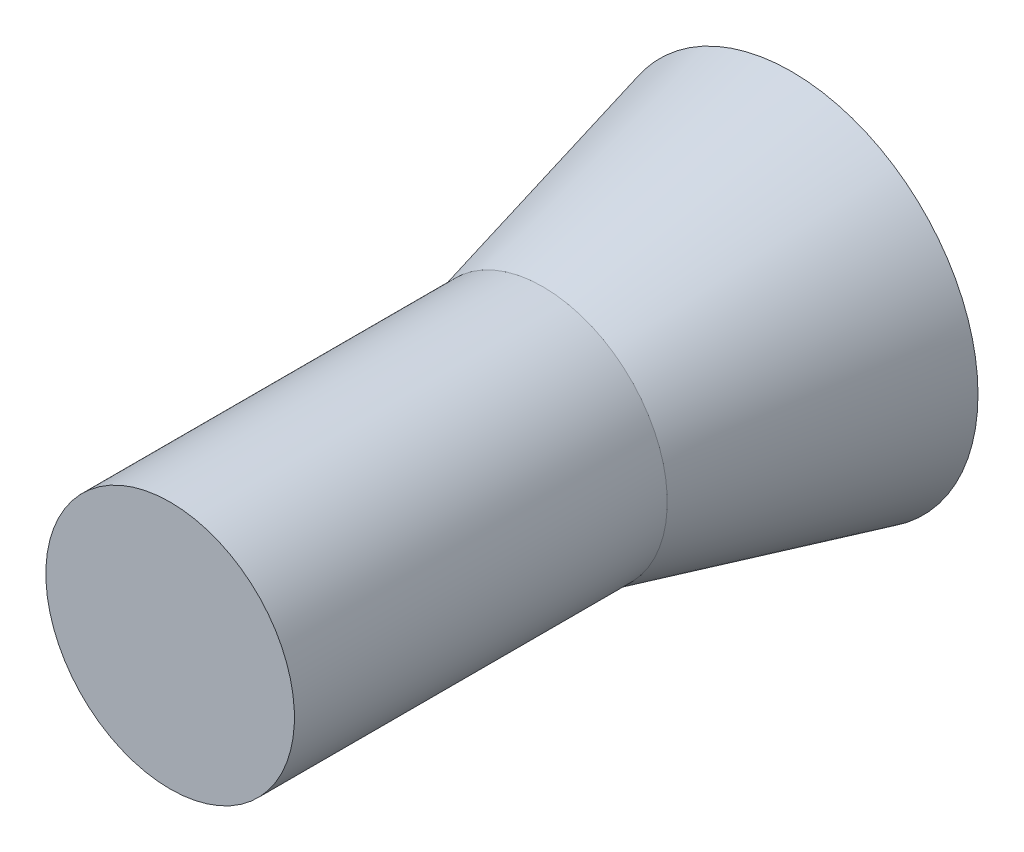
ISO-10303-21;
HEADER;
FILE_DESCRIPTION(('STEP AP214'),'2;1');
FILE_NAME('part.step','',(''),(''),'','','');
FILE_SCHEMA(('AUTOMOTIVE_DESIGN { 1 0 10303 214 1 1 1 1 }'));
ENDSEC;
DATA;
#1=APPLICATION_CONTEXT('core data for automotive mechanical design processes');
#2=APPLICATION_PROTOCOL_DEFINITION('international standard','automotive_design',2000,#1);
#3=PRODUCT_CONTEXT('',#1,'mechanical');
#4=PRODUCT('Part','Part','',(#3));
#5=PRODUCT_RELATED_PRODUCT_CATEGORY('part','',(#4));
#6=PRODUCT_DEFINITION_FORMATION('','',#4);
#7=PRODUCT_DEFINITION_CONTEXT('part definition',#1,'design');
#8=PRODUCT_DEFINITION('design','',#6,#7);
#9=PRODUCT_DEFINITION_SHAPE('','',#8);
#10=(LENGTH_UNIT() NAMED_UNIT(*) SI_UNIT(.MILLI.,.METRE.));
#11=(NAMED_UNIT(*) PLANE_ANGLE_UNIT() SI_UNIT($,.RADIAN.));
#12=(NAMED_UNIT(*) SI_UNIT($,.STERADIAN.) SOLID_ANGLE_UNIT());
#13=UNCERTAINTY_MEASURE_WITH_UNIT(LENGTH_MEASURE(1.E-05),#10,'distance_accuracy_value','');
#14=(GEOMETRIC_REPRESENTATION_CONTEXT(3) GLOBAL_UNCERTAINTY_ASSIGNED_CONTEXT((#13)) GLOBAL_UNIT_ASSIGNED_CONTEXT((#10,
#11,#12)) REPRESENTATION_CONTEXT('',''));
#15=CARTESIAN_POINT('',(0.,0.,0.));
#16=DIRECTION('',(0.,0.,1.));
#17=DIRECTION('',(1.,0.,0.));
#18=AXIS2_PLACEMENT_3D('',#15,#16,#17);
#19=CARTESIAN_POINT('',(0.,15.,0.));
#20=DIRECTION('',(0.,0.,-1.));
#21=DIRECTION('',(0.,1.,0.));
#22=AXIS2_PLACEMENT_3D('',#19,#20,#21);
#23=PLANE('',#22);
#24=CARTESIAN_POINT('',(0.,0.,0.));
#25=DIRECTION('',(0.,0.,-1.));
#26=DIRECTION('',(0.,1.,0.));
#27=AXIS2_PLACEMENT_3D('',#24,#25,#26);
#28=CIRCLE('',#27,15.);
#29=CARTESIAN_POINT('',(0.,15.,0.));
#30=VERTEX_POINT('',#29);
#31=EDGE_CURVE('E41',#30,#30,#28,.T.);
#32=ORIENTED_EDGE('',*,*,#31,.T.);
#33=EDGE_LOOP('',(#32));
#34=FACE_BOUND('',#33,.T.);
#35=ADVANCED_FACE('F31',(#34),#23,.T.);
#36=CARTESIAN_POINT('',(0.,0.,50.));
#37=DIRECTION('',(0.,0.,1.));
#38=DIRECTION('',(0.,-1.,0.));
#39=AXIS2_PLACEMENT_3D('',#36,#37,#38);
#40=PLANE('',#39);
#41=CARTESIAN_POINT('',(0.,0.,50.));
#42=DIRECTION('',(0.,0.,-1.));
#43=DIRECTION('',(0.,1.,0.));
#44=AXIS2_PLACEMENT_3D('',#41,#42,#43);
#45=CIRCLE('',#44,10.);
#46=CARTESIAN_POINT('',(0.,9.99999999999999,50.));
#47=VERTEX_POINT('',#46);
#48=EDGE_CURVE('E10',#47,#47,#45,.T.);
#49=ORIENTED_EDGE('',*,*,#48,.F.);
#50=EDGE_LOOP('',(#49));
#51=FACE_BOUND('',#50,.T.);
#52=ADVANCED_FACE('F56',(#51),#40,.T.);
#53=CARTESIAN_POINT('',(0.,0.,0.));
#54=DIRECTION('',(0.,0.,-1.));
#55=DIRECTION('',(0.,1.,0.));
#56=AXIS2_PLACEMENT_3D('',#53,#54,#55);
#57=CYLINDRICAL_SURFACE('',#56,10.);
#58=ORIENTED_EDGE('',*,*,#48,.T.);
#59=EDGE_LOOP('',(#58));
#60=FACE_BOUND('',#59,.T.);
#61=CARTESIAN_POINT('',(0.,0.,20.));
#62=DIRECTION('',(0.,0.,-1.));
#63=DIRECTION('',(0.,1.,0.));
#64=AXIS2_PLACEMENT_3D('',#61,#62,#63);
#65=CIRCLE('',#64,10.);
#66=CARTESIAN_POINT('',(0.,10.,20.));
#67=VERTEX_POINT('',#66);
#68=EDGE_CURVE('E37',#67,#67,#65,.T.);
#69=ORIENTED_EDGE('',*,*,#68,.F.);
#70=EDGE_LOOP('',(#69));
#71=FACE_BOUND('',#70,.T.);
#72=ADVANCED_FACE('F51',(#60,#71),#57,.T.);
#73=CARTESIAN_POINT('',(0.,0.,0.));
#74=DIRECTION('',(0.,0.,-1.));
#75=DIRECTION('',(0.,1.,0.));
#76=AXIS2_PLACEMENT_3D('',#73,#74,#75);
#77=CONICAL_SURFACE('',#76,15.,0.244978663126864);
#78=ORIENTED_EDGE('',*,*,#68,.T.);
#79=EDGE_LOOP('',(#78));
#80=FACE_BOUND('',#79,.T.);
#81=ORIENTED_EDGE('',*,*,#31,.F.);
#82=EDGE_LOOP('',(#81));
#83=FACE_BOUND('',#82,.T.);
#84=ADVANCED_FACE('F49',(#80,#83),#77,.T.);
#85=CLOSED_SHELL('',(#35,#52,#72,#84));
#86=MANIFOLD_SOLID_BREP('B2',#85);
#87=ADVANCED_BREP_SHAPE_REPRESENTATION('',(#18,#86),#14);
#88=SHAPE_DEFINITION_REPRESENTATION(#9,#87);
ENDSEC;
END-ISO-10303-21;
